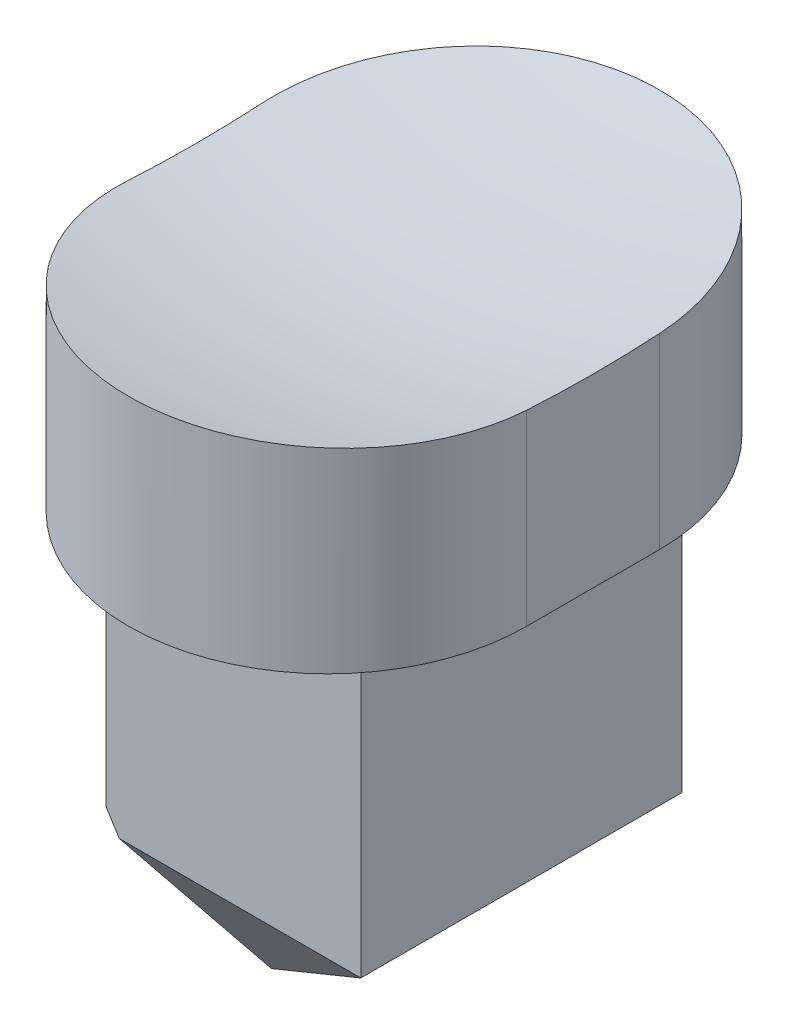
ISO-10303-21;
HEADER;
FILE_DESCRIPTION(('STEP AP214'),'2;1');
FILE_NAME('part.step','',(''),(''),'','','');
FILE_SCHEMA(('AUTOMOTIVE_DESIGN { 1 0 10303 214 1 1 1 1 }'));
ENDSEC;
DATA;
#1=APPLICATION_CONTEXT('core data for automotive mechanical design processes');
#2=APPLICATION_PROTOCOL_DEFINITION('international standard','automotive_design',2000,#1);
#3=PRODUCT_CONTEXT('',#1,'mechanical');
#4=PRODUCT('Part','Part','',(#3));
#5=PRODUCT_RELATED_PRODUCT_CATEGORY('part','',(#4));
#6=PRODUCT_DEFINITION_FORMATION('','',#4);
#7=PRODUCT_DEFINITION_CONTEXT('part definition',#1,'design');
#8=PRODUCT_DEFINITION('design','',#6,#7);
#9=PRODUCT_DEFINITION_SHAPE('','',#8);
#10=(LENGTH_UNIT() NAMED_UNIT(*) SI_UNIT(.MILLI.,.METRE.));
#11=(NAMED_UNIT(*) PLANE_ANGLE_UNIT() SI_UNIT($,.RADIAN.));
#12=(NAMED_UNIT(*) SI_UNIT($,.STERADIAN.) SOLID_ANGLE_UNIT());
#13=UNCERTAINTY_MEASURE_WITH_UNIT(LENGTH_MEASURE(1.E-05),#10,'distance_accuracy_value','');
#14=(GEOMETRIC_REPRESENTATION_CONTEXT(3) GLOBAL_UNCERTAINTY_ASSIGNED_CONTEXT((#13)) GLOBAL_UNIT_ASSIGNED_CONTEXT((#10,
#11,#12)) REPRESENTATION_CONTEXT('',''));
#15=CARTESIAN_POINT('',(0.,0.,0.));
#16=DIRECTION('',(0.,0.,1.));
#17=DIRECTION('',(1.,0.,0.));
#18=AXIS2_PLACEMENT_3D('',#15,#16,#17);
#19=CARTESIAN_POINT('',(0.,22.1,-5.));
#20=DIRECTION('',(0.,1.,0.));
#21=DIRECTION('',(0.,0.,1.));
#22=AXIS2_PLACEMENT_3D('',#19,#20,#21);
#23=PLANE('',#22);
#24=DIRECTION('',(1.,0.,0.));
#25=VECTOR('',#24,1.);
#26=CARTESIAN_POINT('',(0.,22.1,13.15));
#27=LINE('',#26,#25);
#28=CARTESIAN_POINT('',(-10.65,22.1,13.15));
#29=VERTEX_POINT('',#28);
#30=CARTESIAN_POINT('',(10.65,22.1,13.15));
#31=VERTEX_POINT('',#30);
#32=EDGE_CURVE('E301',#29,#31,#27,.T.);
#33=ORIENTED_EDGE('',*,*,#32,.T.);
#34=DIRECTION('',(0.,0.,-1.));
#35=VECTOR('',#34,1.);
#36=CARTESIAN_POINT('',(10.65,22.1,-5.));
#37=LINE('',#36,#35);
#38=CARTESIAN_POINT('',(10.65,22.1,-13.15));
#39=VERTEX_POINT('',#38);
#40=EDGE_CURVE('E330',#31,#39,#37,.T.);
#41=ORIENTED_EDGE('',*,*,#40,.T.);
#42=DIRECTION('',(-1.,0.,0.));
#43=VECTOR('',#42,1.);
#44=CARTESIAN_POINT('',(0.,22.1,-13.15));
#45=LINE('',#44,#43);
#46=CARTESIAN_POINT('',(-10.65,22.1,-13.15));
#47=VERTEX_POINT('',#46);
#48=EDGE_CURVE('E328',#39,#47,#45,.T.);
#49=ORIENTED_EDGE('',*,*,#48,.T.);
#50=DIRECTION('',(0.,0.,1.));
#51=VECTOR('',#50,1.);
#52=CARTESIAN_POINT('',(-10.65,22.1,-5.));
#53=LINE('',#52,#51);
#54=EDGE_CURVE('E326',#47,#29,#53,.T.);
#55=ORIENTED_EDGE('',*,*,#54,.T.);
#56=EDGE_LOOP('',(#33,#41,#49,#55));
#57=FACE_BOUND('',#56,.T.);
#58=CARTESIAN_POINT('',(0.,22.1,-5.));
#59=DIRECTION('',(0.,1.,0.));
#60=DIRECTION('',(0.,0.,1.));
#61=AXIS2_PLACEMENT_3D('',#58,#59,#60);
#62=CIRCLE('',#61,15.);
#63=CARTESIAN_POINT('',(15.,22.1,-4.99999999999999));
#64=VERTEX_POINT('',#63);
#65=CARTESIAN_POINT('',(-15.,22.1,-4.99999999999999));
#66=VERTEX_POINT('',#65);
#67=EDGE_CURVE('E220',#64,#66,#62,.T.);
#68=ORIENTED_EDGE('',*,*,#67,.F.);
#69=DIRECTION('',(0.,0.,-1.));
#70=VECTOR('',#69,1.);
#71=CARTESIAN_POINT('',(15.,22.1,-4.99999999999999));
#72=LINE('',#71,#70);
#73=CARTESIAN_POINT('',(15.,22.1,4.99999999999999));
#74=VERTEX_POINT('',#73);
#75=EDGE_CURVE('E186',#74,#64,#72,.T.);
#76=ORIENTED_EDGE('',*,*,#75,.F.);
#77=CARTESIAN_POINT('',(0.,22.1,5.));
#78=DIRECTION('',(0.,1.,0.));
#79=DIRECTION('',(0.,0.,1.));
#80=AXIS2_PLACEMENT_3D('',#77,#78,#79);
#81=CIRCLE('',#80,15.);
#82=CARTESIAN_POINT('',(-15.,22.1,4.99999999999998));
#83=VERTEX_POINT('',#82);
#84=EDGE_CURVE('E213',#83,#74,#81,.T.);
#85=ORIENTED_EDGE('',*,*,#84,.F.);
#86=DIRECTION('',(0.,0.,1.));
#87=VECTOR('',#86,1.);
#88=CARTESIAN_POINT('',(-15.,22.1,-4.99999999999999));
#89=LINE('',#88,#87);
#90=EDGE_CURVE('E209',#66,#83,#89,.T.);
#91=ORIENTED_EDGE('',*,*,#90,.F.);
#92=EDGE_LOOP('',(#68,#76,#85,#91));
#93=FACE_BOUND('',#92,.T.);
#94=ADVANCED_FACE('F96',(#57,#93),#23,.F.);
#95=CARTESIAN_POINT('',(0.,37.1,-5.));
#96=DIRECTION('',(0.,-1.,0.));
#97=DIRECTION('',(0.,0.,-1.));
#98=AXIS2_PLACEMENT_3D('',#95,#96,#97);
#99=CYLINDRICAL_SURFACE('',#98,15.);
#100=DIRECTION('',(0.,-1.,0.));
#101=VECTOR('',#100,1.);
#102=CARTESIAN_POINT('',(-15.,37.1,-4.99999999999999));
#103=LINE('',#102,#101);
#104=CARTESIAN_POINT('',(-15.,36.2001789978045,-4.99999999999999));
#105=VERTEX_POINT('',#104);
#106=EDGE_CURVE('E207',#105,#66,#103,.T.);
#107=ORIENTED_EDGE('',*,*,#106,.F.);
#108=CARTESIAN_POINT('',(-14.9999999986667,36.2001670646057,-4.99979999999999));
#109=CARTESIAN_POINT('',(-15.0000505971134,36.225372023753,-5.4222362160583));
#110=CARTESIAN_POINT('',(-14.9821679105655,36.2505881800374,-5.84466570095554));
#111=CARTESIAN_POINT('',(-14.9108609043045,36.300862785471,-6.68650562986717));
#112=CARTESIAN_POINT('',(-14.8574381659499,36.3259212415869,-7.10591620736893));
#113=CARTESIAN_POINT('',(-14.7154223005256,36.375686374263,-7.93847907650016));
#114=CARTESIAN_POINT('',(-14.6268521512979,36.4003932697485,-8.35163527413465));
#115=CARTESIAN_POINT('',(-14.4151793673019,36.4492950471374,-9.1690299406811));
#116=CARTESIAN_POINT('',(-14.292077173893,36.4734899355806,-9.57326852349926));
#117=CARTESIAN_POINT('',(-14.0121336587021,36.5212061012485,-10.3701538849595));
#118=CARTESIAN_POINT('',(-13.8552758604046,36.5447270431359,-10.7627948958668));
#119=CARTESIAN_POINT('',(-13.5089637359969,36.590913401162,-11.5334806097786));
#120=CARTESIAN_POINT('',(-13.3195094386151,36.6135788180546,-11.911525325647));
#121=CARTESIAN_POINT('',(-12.9093836228457,36.6578855797966,-12.650245472503));
#122=CARTESIAN_POINT('',(-12.6887185384304,36.679527134487,-13.0109244628722));
#123=CARTESIAN_POINT('',(-12.217702380577,36.7216339066189,-13.7124184148315));
#124=CARTESIAN_POINT('',(-11.9673514637172,36.7420991302643,-14.05323348118));
#125=CARTESIAN_POINT('',(-11.4389338729753,36.7816892599247,-14.712314921096));
#126=CARTESIAN_POINT('',(-11.1608881896398,36.8008151625988,-15.0305980638216));
#127=CARTESIAN_POINT('',(-10.5788921592146,36.8376038273064,-15.6426201274413));
#128=CARTESIAN_POINT('',(-10.2749417745466,36.8552665872172,-15.9363590127294));
#129=CARTESIAN_POINT('',(-9.64324599968441,36.88900186209,-16.4972273210325));
#130=CARTESIAN_POINT('',(-9.31549710200202,36.9050741418145,-16.764352807876));
#131=CARTESIAN_POINT('',(-8.6385739128506,36.9355071163803,-17.2700253616051));
#132=CARTESIAN_POINT('',(-8.28939965765111,36.9498678141188,-17.508572476867));
#133=CARTESIAN_POINT('',(-7.57273722717455,36.9767480824665,-17.9549821451278));
#134=CARTESIAN_POINT('',(-7.20528201927106,36.9892708171931,-18.1628974342883));
#135=CARTESIAN_POINT('',(-6.45410999467888,37.01241245355,-18.5470447185739));
#136=CARTESIAN_POINT('',(-6.07039319391636,37.0230313570449,-18.7232767447279));
#137=CARTESIAN_POINT('',(-5.28945725430007,37.0422859979748,-19.0427780307539));
#138=CARTESIAN_POINT('',(-4.89223908545358,37.050921877536,-19.1860496529486));
#139=CARTESIAN_POINT('',(-4.08710512381802,37.0661473428441,-19.4386141454512));
#140=CARTESIAN_POINT('',(-3.67918934188229,37.0727369306668,-19.5479070502309));
#141=CARTESIAN_POINT('',(-2.85622623604338,37.0838119920331,-19.7315796883256));
#142=CARTESIAN_POINT('',(-2.44119129872767,37.0883007984586,-19.8060147236421));
#143=CARTESIAN_POINT('',(-1.60631240182303,37.0951564780238,-19.9196932375491));
#144=CARTESIAN_POINT('',(-1.18646844743868,37.0975233534596,-19.9589367542221));
#145=CARTESIAN_POINT('',(-0.344953273708517,37.1001176139483,-20.001950207149));
#146=CARTESIAN_POINT('',(0.0767179779047312,37.100344961065,-20.0057195144048));
#147=CARTESIAN_POINT('',(0.918877310137343,37.0986583762127,-19.9777557681976));
#148=CARTESIAN_POINT('',(1.33936539105418,37.096744444782,-19.9460227236614));
#149=CARTESIAN_POINT('',(2.17582436034105,37.0907919455528,-19.8473228610139));
#150=CARTESIAN_POINT('',(2.5917986360909,37.0867551023708,-19.7803846429692));
#151=CARTESIAN_POINT('',(3.41662021867459,37.076587741602,-19.6117725229433));
#152=CARTESIAN_POINT('',(3.82546753065938,37.0704572255285,-19.5100986460679));
#153=CARTESIAN_POINT('',(4.63313065257542,37.0561479300767,-19.272745493707));
#154=CARTESIAN_POINT('',(5.03194649796884,37.0479691579404,-19.1370663384519));
#155=CARTESIAN_POINT('',(5.81671915611364,37.0296237807565,-18.8326754109088));
#156=CARTESIAN_POINT('',(6.20267596252054,37.0194571747281,-18.6639636223232));
#157=CARTESIAN_POINT('',(6.95914649743477,36.997206664887,-18.2946422311087));
#158=CARTESIAN_POINT('',(7.32965401650439,36.9851219993631,-18.0940199559307));
#159=CARTESIAN_POINT('',(8.05243956871306,36.9591272223988,-17.662361718047));
#160=CARTESIAN_POINT('',(8.40471759436956,36.945217110209,-17.4313257428578));
#161=CARTESIAN_POINT('',(9.08853860660945,36.9156741731514,-16.9405019991736));
#162=CARTESIAN_POINT('',(9.42008251368116,36.9000414248449,-16.6807155084741));
#163=CARTESIAN_POINT('',(10.0601125324881,36.8671670603081,-16.1342357508033));
#164=CARTESIAN_POINT('',(10.3685986625505,36.8499254453565,-15.847542505219));
#165=CARTESIAN_POINT('',(10.9607072661255,36.8139366891092,-15.2489194936914));
#166=CARTESIAN_POINT('',(11.2442984914738,36.7951877107306,-14.9369589299258));
#167=CARTESIAN_POINT('',(11.7841914602273,36.756339134032,-14.2903302847405));
#168=CARTESIAN_POINT('',(12.0404929784728,36.7362395245706,-13.9556620160034));
#169=CARTESIAN_POINT('',(12.5240821456442,36.6948285623558,-13.2658840525618));
#170=CARTESIAN_POINT('',(12.7513600065915,36.6735168042996,-12.9107675201289));
#171=CARTESIAN_POINT('',(13.1751970272208,36.6298423552078,-12.1827291049954));
#172=CARTESIAN_POINT('',(13.3717570847364,36.6074796949133,-11.8098077431183));
#173=CARTESIAN_POINT('',(13.7332179907482,36.5618094183407,-11.0478875081639));
#174=CARTESIAN_POINT('',(13.8980422253582,36.5384996758395,-10.6588524164859));
#175=CARTESIAN_POINT('',(14.1942860222416,36.4911532445589,-9.86830739179908));
#176=CARTESIAN_POINT('',(14.3257057335659,36.4671165590235,-9.46679751446172));
#177=CARTESIAN_POINT('',(14.5540704193931,36.4185205439717,-8.65468816199068));
#178=CARTESIAN_POINT('',(14.6510591891351,36.3939619208176,-8.24410094467479));
#179=CARTESIAN_POINT('',(14.8100796881022,36.3444766353984,-7.41640222588438));
#180=CARTESIAN_POINT('',(14.8721285052236,36.3195501591691,-6.99929401636119));
#181=CARTESIAN_POINT('',(14.9443461299928,36.2788364920903,-6.31770273442135));
#182=CARTESIAN_POINT('',(14.965232792922,36.2631073330853,-6.05430539317481));
#183=CARTESIAN_POINT('',(14.9930514530183,36.2316402058825,-5.52721450506767));
#184=CARTESIAN_POINT('',(15.0000065075313,36.2159022954325,-5.26352217152712));
#185=CARTESIAN_POINT('',(14.9999999986667,36.2001670646057,-4.99979999999999));
#186=B_SPLINE_CURVE_WITH_KNOTS('',3,(#108,#109,#110,#111,#112,#113,#114,#115,#116,#117,#118,
#119,#120,#121,#122,#123,#124,#125,#126,#127,#128,#129,#130,#131,#132,#133,#134,#135,#136,#137,
#138,#139,#140,#141,#142,#143,#144,#145,#146,#147,#148,#149,#150,#151,#152,#153,#154,#155,#156,
#157,#158,#159,#160,#161,#162,#163,#164,#165,#166,#167,#168,#169,#170,#171,#172,#173,#174,#175,
#176,#177,#178,#179,#180,#181,#182,#183,#184,#185),.UNSPECIFIED.,.F.,.F.,(4,2,2,2,2,2,2,2,2,2,2,
2,2,2,2,2,2,2,2,2,2,2,2,2,2,2,2,2,2,2,2,2,2,2,2,2,2,2,4),(0.,1.26917572026778,2.53829497219462,
3.80658589265856,5.07486060363743,6.34375578456622,7.61264984717396,8.88128271282821,
10.149908887357,11.4175807514039,12.6852544544128,13.9531153712605,15.2209741418907,
16.486623982296,17.7522725831864,19.0178304448206,20.2833870225228,21.5469289355155,
22.8104694811646,24.0740324307842,25.3375950626915,26.6001327804068,27.862669585599,
29.125201926978,30.387734891265,31.6507705004315,32.9138066280253,34.1767866434419,
35.439765654983,36.7043079466293,37.9688606708409,39.2338387346364,40.498779818175,
41.7667373436089,43.0346892113164,44.3010224500856,45.5667358309269,46.3604734084631,
47.152896230875),.UNSPECIFIED.);
#187=CARTESIAN_POINT('',(15.,36.2001789978045,-4.99999999999999));
#188=VERTEX_POINT('',#187);
#189=EDGE_CURVE('E202',#105,#188,#186,.T.);
#190=ORIENTED_EDGE('',*,*,#189,.T.);
#191=DIRECTION('',(0.,-1.,0.));
#192=VECTOR('',#191,1.);
#193=CARTESIAN_POINT('',(15.,37.1,-4.99999999999999));
#194=LINE('',#193,#192);
#195=EDGE_CURVE('E218',#188,#64,#194,.T.);
#196=ORIENTED_EDGE('',*,*,#195,.T.);
#197=ORIENTED_EDGE('',*,*,#67,.T.);
#198=EDGE_LOOP('',(#107,#190,#196,#197));
#199=FACE_BOUND('',#198,.T.);
#200=ADVANCED_FACE('F244',(#199),#99,.T.);
#201=CARTESIAN_POINT('',(-15.,37.1,-4.99999999999999));
#202=DIRECTION('',(1.,0.,0.));
#203=DIRECTION('',(0.,0.,-1.));
#204=AXIS2_PLACEMENT_3D('',#201,#202,#203);
#205=PLANE('',#204);
#206=DIRECTION('',(0.,-1.,0.));
#207=VECTOR('',#206,1.);
#208=CARTESIAN_POINT('',(-15.,37.1,4.99999999999998));
#209=LINE('',#208,#207);
#210=CARTESIAN_POINT('',(-15.,36.2001789978045,4.99999999999998));
#211=VERTEX_POINT('',#210);
#212=EDGE_CURVE('E211',#211,#83,#209,.T.);
#213=ORIENTED_EDGE('',*,*,#212,.F.);
#214=CARTESIAN_POINT('',(-15.,120.,0.));
#215=DIRECTION('',(1.,0.,0.));
#216=DIRECTION('',(0.,0.,-1.));
#217=AXIS2_PLACEMENT_3D('',#214,#215,#216);
#218=CIRCLE('',#217,83.9488534763876);
#219=EDGE_CURVE('E210',#211,#105,#218,.T.);
#220=ORIENTED_EDGE('',*,*,#219,.T.);
#221=ORIENTED_EDGE('',*,*,#106,.T.);
#222=ORIENTED_EDGE('',*,*,#90,.T.);
#223=EDGE_LOOP('',(#213,#220,#221,#222));
#224=FACE_BOUND('',#223,.T.);
#225=ADVANCED_FACE('F296',(#224),#205,.F.);
#226=CARTESIAN_POINT('',(0.,37.1,5.));
#227=DIRECTION('',(0.,-1.,0.));
#228=DIRECTION('',(0.,0.,-1.));
#229=AXIS2_PLACEMENT_3D('',#226,#227,#228);
#230=CYLINDRICAL_SURFACE('',#229,15.);
#231=DIRECTION('',(0.,-1.,0.));
#232=VECTOR('',#231,1.);
#233=CARTESIAN_POINT('',(15.,37.1,4.99999999999999));
#234=LINE('',#233,#232);
#235=CARTESIAN_POINT('',(15.,36.2001789978045,4.99999999999999));
#236=VERTEX_POINT('',#235);
#237=EDGE_CURVE('E215',#236,#74,#234,.T.);
#238=ORIENTED_EDGE('',*,*,#237,.F.);
#239=CARTESIAN_POINT('',(14.9999999986667,36.2001670646057,4.99979999999998));
#240=CARTESIAN_POINT('',(15.0000505971134,36.225372023753,5.4222362160583));
#241=CARTESIAN_POINT('',(14.9821679105655,36.2505881800374,5.84466570095554));
#242=CARTESIAN_POINT('',(14.9108609043045,36.300862785471,6.68650562986717));
#243=CARTESIAN_POINT('',(14.8574381659499,36.3259212415869,7.10591620736892));
#244=CARTESIAN_POINT('',(14.7154223005256,36.375686374263,7.93847907650015));
#245=CARTESIAN_POINT('',(14.6268521512979,36.4003932697485,8.35163527413464));
#246=CARTESIAN_POINT('',(14.4151793673019,36.4492950471374,9.16902994068109));
#247=CARTESIAN_POINT('',(14.292077173893,36.4734899355806,9.57326852349926));
#248=CARTESIAN_POINT('',(14.0121336587021,36.5212061012485,10.3701538849595));
#249=CARTESIAN_POINT('',(13.8552758604046,36.5447270431359,10.7627948958668));
#250=CARTESIAN_POINT('',(13.5089637359969,36.590913401162,11.5334806097786));
#251=CARTESIAN_POINT('',(13.3195094386151,36.6135788180546,11.911525325647));
#252=CARTESIAN_POINT('',(12.9093836228457,36.6578855797966,12.650245472503));
#253=CARTESIAN_POINT('',(12.6887185384304,36.679527134487,13.0109244628722));
#254=CARTESIAN_POINT('',(12.217702380577,36.7216339066189,13.7124184148314));
#255=CARTESIAN_POINT('',(11.9673514637172,36.7420991302643,14.05323348118));
#256=CARTESIAN_POINT('',(11.4389338729753,36.7816892599247,14.712314921096));
#257=CARTESIAN_POINT('',(11.1608881896398,36.8008151625989,15.0305980638216));
#258=CARTESIAN_POINT('',(10.5788921592146,36.8376038273064,15.6426201274413));
#259=CARTESIAN_POINT('',(10.2749417745466,36.8552665872172,15.9363590127294));
#260=CARTESIAN_POINT('',(9.64324599968442,36.88900186209,16.4972273210324));
#261=CARTESIAN_POINT('',(9.31549710200203,36.9050741418145,16.764352807876));
#262=CARTESIAN_POINT('',(8.6385739128506,36.9355071163802,17.2700253616051));
#263=CARTESIAN_POINT('',(8.28939965765112,36.9498678141188,17.508572476867));
#264=CARTESIAN_POINT('',(7.57273722717456,36.9767480824665,17.9549821451278));
#265=CARTESIAN_POINT('',(7.20528201927107,36.9892708171931,18.1628974342883));
#266=CARTESIAN_POINT('',(6.45410999467889,37.01241245355,18.5470447185739));
#267=CARTESIAN_POINT('',(6.07039319391637,37.0230313570449,18.7232767447279));
#268=CARTESIAN_POINT('',(5.28945725430008,37.0422859979747,19.0427780307539));
#269=CARTESIAN_POINT('',(4.89223908545359,37.050921877536,19.1860496529486));
#270=CARTESIAN_POINT('',(4.08710512381802,37.0661473428441,19.4386141454512));
#271=CARTESIAN_POINT('',(3.6791893418823,37.0727369306668,19.5479070502309));
#272=CARTESIAN_POINT('',(2.85622623604339,37.0838119920331,19.7315796883256));
#273=CARTESIAN_POINT('',(2.44119129872767,37.0883007984586,19.8060147236421));
#274=CARTESIAN_POINT('',(1.60631240182304,37.0951564780238,19.9196932375491));
#275=CARTESIAN_POINT('',(1.18646844743869,37.0975233534596,19.9589367542221));
#276=CARTESIAN_POINT('',(0.344953273708525,37.1001176139483,20.001950207149));
#277=CARTESIAN_POINT('',(-0.0767179779047238,37.100344961065,20.0057195144048));
#278=CARTESIAN_POINT('',(-0.918877310137338,37.0986583762127,19.9777557681976));
#279=CARTESIAN_POINT('',(-1.33936539105417,37.096744444782,19.9460227236614));
#280=CARTESIAN_POINT('',(-2.17582436034105,37.0907919455528,19.8473228610139));
#281=CARTESIAN_POINT('',(-2.59179863609089,37.0867551023708,19.7803846429692));
#282=CARTESIAN_POINT('',(-3.41662021867459,37.076587741602,19.6117725229433));
#283=CARTESIAN_POINT('',(-3.82546753065938,37.0704572255285,19.5100986460679));
#284=CARTESIAN_POINT('',(-4.63313065257541,37.0561479300767,19.272745493707));
#285=CARTESIAN_POINT('',(-5.03194649796883,37.0479691579404,19.1370663384519));
#286=CARTESIAN_POINT('',(-5.81671915611363,37.0296237807565,18.8326754109088));
#287=CARTESIAN_POINT('',(-6.20267596252054,37.0194571747281,18.6639636223232));
#288=CARTESIAN_POINT('',(-6.95914649743477,36.997206664887,18.2946422311087));
#289=CARTESIAN_POINT('',(-7.32965401650439,36.9851219993631,18.0940199559307));
#290=CARTESIAN_POINT('',(-8.05243956871306,36.9591272223988,17.662361718047));
#291=CARTESIAN_POINT('',(-8.40471759436956,36.945217110209,17.4313257428578));
#292=CARTESIAN_POINT('',(-9.08853860660945,36.9156741731514,16.9405019991737));
#293=CARTESIAN_POINT('',(-9.42008251368116,36.9000414248449,16.6807155084741));
#294=CARTESIAN_POINT('',(-10.0601125324881,36.8671670603081,16.1342357508033));
#295=CARTESIAN_POINT('',(-10.3685986625505,36.8499254453565,15.847542505219));
#296=CARTESIAN_POINT('',(-10.9607072661255,36.8139366891092,15.2489194936914));
#297=CARTESIAN_POINT('',(-11.2442984914738,36.7951877107306,14.9369589299258));
#298=CARTESIAN_POINT('',(-11.7841914602273,36.756339134032,14.2903302847405));
#299=CARTESIAN_POINT('',(-12.0404929784728,36.7362395245706,13.9556620160034));
#300=CARTESIAN_POINT('',(-12.5240821456442,36.6948285623558,13.2658840525619));
#301=CARTESIAN_POINT('',(-12.7513600065915,36.6735168042995,12.9107675201289));
#302=CARTESIAN_POINT('',(-13.1751970272208,36.6298423552078,12.1827291049954));
#303=CARTESIAN_POINT('',(-13.3717570847364,36.6074796949134,11.8098077431183));
#304=CARTESIAN_POINT('',(-13.7332179907482,36.5618094183407,11.0478875081639));
#305=CARTESIAN_POINT('',(-13.8980422253582,36.5384996758396,10.6588524164859));
#306=CARTESIAN_POINT('',(-14.1942860222416,36.4911532445589,9.86830739179909));
#307=CARTESIAN_POINT('',(-14.3257057335659,36.4671165590235,9.46679751446173));
#308=CARTESIAN_POINT('',(-14.5540704193931,36.4185205439717,8.6546881619907));
#309=CARTESIAN_POINT('',(-14.6510591891351,36.3939619208176,8.2441009446748));
#310=CARTESIAN_POINT('',(-14.8100796881022,36.3444766353984,7.41640222588439));
#311=CARTESIAN_POINT('',(-14.8721285052236,36.3195501591691,6.9992940163612));
#312=CARTESIAN_POINT('',(-14.9443461299928,36.2788364920903,6.31770273442136));
#313=CARTESIAN_POINT('',(-14.965232792922,36.2631073330853,6.05430539317482));
#314=CARTESIAN_POINT('',(-14.9930514530183,36.2316402058825,5.52721450506767));
#315=CARTESIAN_POINT('',(-15.0000065075313,36.2159022954325,5.26352217152712));
#316=CARTESIAN_POINT('',(-14.9999999986667,36.2001670646057,4.99979999999998));
#317=B_SPLINE_CURVE_WITH_KNOTS('',3,(#239,#240,#241,#242,#243,#244,#245,#246,#247,#248,#249,
#250,#251,#252,#253,#254,#255,#256,#257,#258,#259,#260,#261,#262,#263,#264,#265,#266,#267,#268,
#269,#270,#271,#272,#273,#274,#275,#276,#277,#278,#279,#280,#281,#282,#283,#284,#285,#286,#287,
#288,#289,#290,#291,#292,#293,#294,#295,#296,#297,#298,#299,#300,#301,#302,#303,#304,#305,#306,
#307,#308,#309,#310,#311,#312,#313,#314,#315,#316),.UNSPECIFIED.,.F.,.F.,(4,2,2,2,2,2,2,2,2,2,2,
2,2,2,2,2,2,2,2,2,2,2,2,2,2,2,2,2,2,2,2,2,2,2,2,2,2,2,4),(0.,1.26917572026778,2.53829497219462,
3.80658589265856,5.07486060363742,6.34375578456621,7.61264984717395,8.8812827128282,
10.149908887357,11.4175807514039,12.6852544544128,13.9531153712605,15.2209741418907,
16.486623982296,17.7522725831863,19.0178304448206,20.2833870225228,21.5469289355155,
22.8104694811646,24.0740324307842,25.3375950626915,26.6001327804068,27.862669585599,
29.125201926978,30.387734891265,31.6507705004315,32.9138066280253,34.1767866434419,
35.439765654983,36.7043079466294,37.9688606708409,39.2338387346364,40.498779818175,
41.7667373436089,43.0346892113164,44.3010224500856,45.5667358309269,46.3604734084631,
47.152896230875),.UNSPECIFIED.);
#318=EDGE_CURVE('E214',#236,#211,#317,.T.);
#319=ORIENTED_EDGE('',*,*,#318,.T.);
#320=ORIENTED_EDGE('',*,*,#212,.T.);
#321=ORIENTED_EDGE('',*,*,#84,.T.);
#322=EDGE_LOOP('',(#238,#319,#320,#321));
#323=FACE_BOUND('',#322,.T.);
#324=ADVANCED_FACE('F315',(#323),#230,.T.);
#325=CARTESIAN_POINT('',(15.,37.1,-4.99999999999999));
#326=DIRECTION('',(-1.,0.,0.));
#327=DIRECTION('',(0.,0.,1.));
#328=AXIS2_PLACEMENT_3D('',#325,#326,#327);
#329=PLANE('',#328);
#330=ORIENTED_EDGE('',*,*,#195,.F.);
#331=CARTESIAN_POINT('',(15.,120.,0.));
#332=DIRECTION('',(-1.,0.,0.));
#333=DIRECTION('',(0.,0.,1.));
#334=AXIS2_PLACEMENT_3D('',#331,#332,#333);
#335=CIRCLE('',#334,83.9488534763876);
#336=EDGE_CURVE('E217',#188,#236,#335,.T.);
#337=ORIENTED_EDGE('',*,*,#336,.T.);
#338=ORIENTED_EDGE('',*,*,#237,.T.);
#339=ORIENTED_EDGE('',*,*,#75,.T.);
#340=EDGE_LOOP('',(#330,#337,#338,#339));
#341=FACE_BOUND('',#340,.T.);
#342=ADVANCED_FACE('F252',(#341),#329,.F.);
#343=CARTESIAN_POINT('',(0.,120.,0.));
#344=DIRECTION('',(0.,0.,1.));
#345=DIRECTION('',(0.,1.,0.));
#346=AXIS2_PLACEMENT_3D('',#343,#344,#345);
#347=SPHERICAL_SURFACE('',#346,85.278426345706);
#348=ORIENTED_EDGE('',*,*,#318,.F.);
#349=ORIENTED_EDGE('',*,*,#336,.F.);
#350=ORIENTED_EDGE('',*,*,#189,.F.);
#351=ORIENTED_EDGE('',*,*,#219,.F.);
#352=EDGE_LOOP('',(#348,#349,#350,#351));
#353=FACE_BOUND('',#352,.T.);
#354=ADVANCED_FACE('F247',(#353),#347,.F.);
#355=CARTESIAN_POINT('',(9.9,32.1,0.));
#356=DIRECTION('',(1.,0.,0.));
#357=DIRECTION('',(0.,0.,-1.));
#358=AXIS2_PLACEMENT_3D('',#355,#356,#357);
#359=PLANE('',#358);
#360=DIRECTION('',(0.,-1.,0.));
#361=VECTOR('',#360,1.);
#362=CARTESIAN_POINT('',(9.9,32.1,-12.4));
#363=LINE('',#362,#361);
#364=CARTESIAN_POINT('',(9.9,32.4,-12.4));
#365=VERTEX_POINT('',#364);
#366=CARTESIAN_POINT('',(9.9,22.85,-12.4));
#367=VERTEX_POINT('',#366);
#368=EDGE_CURVE('E174',#365,#367,#363,.T.);
#369=ORIENTED_EDGE('',*,*,#368,.T.);
#370=DIRECTION('',(0.,0.,1.));
#371=VECTOR('',#370,1.);
#372=CARTESIAN_POINT('',(9.9,22.85,0.));
#373=LINE('',#372,#371);
#374=CARTESIAN_POINT('',(9.9,22.85,12.4));
#375=VERTEX_POINT('',#374);
#376=EDGE_CURVE('E195',#367,#375,#373,.T.);
#377=ORIENTED_EDGE('',*,*,#376,.T.);
#378=DIRECTION('',(0.,-1.,0.));
#379=VECTOR('',#378,1.);
#380=CARTESIAN_POINT('',(9.9,32.1,12.4));
#381=LINE('',#380,#379);
#382=CARTESIAN_POINT('',(9.9,32.4,12.4));
#383=VERTEX_POINT('',#382);
#384=EDGE_CURVE('E199',#383,#375,#381,.T.);
#385=ORIENTED_EDGE('',*,*,#384,.F.);
#386=DIRECTION('',(0.,0.,1.));
#387=VECTOR('',#386,1.);
#388=CARTESIAN_POINT('',(9.9,32.4,12.4));
#389=LINE('',#388,#387);
#390=EDGE_CURVE('E192',#365,#383,#389,.T.);
#391=ORIENTED_EDGE('',*,*,#390,.F.);
#392=EDGE_LOOP('',(#369,#377,#385,#391));
#393=FACE_BOUND('',#392,.T.);
#394=ADVANCED_FACE('F198',(#393),#359,.F.);
#395=CARTESIAN_POINT('',(0.,32.1,-12.4));
#396=DIRECTION('',(0.,0.,-1.));
#397=DIRECTION('',(-1.,0.,0.));
#398=AXIS2_PLACEMENT_3D('',#395,#396,#397);
#399=PLANE('',#398);
#400=DIRECTION('',(0.,-1.,0.));
#401=VECTOR('',#400,1.);
#402=CARTESIAN_POINT('',(-9.9,32.1,-12.4));
#403=LINE('',#402,#401);
#404=CARTESIAN_POINT('',(-9.9,32.4,-12.4));
#405=VERTEX_POINT('',#404);
#406=CARTESIAN_POINT('',(-9.9,22.85,-12.4));
#407=VERTEX_POINT('',#406);
#408=EDGE_CURVE('E185',#405,#407,#403,.T.);
#409=ORIENTED_EDGE('',*,*,#408,.T.);
#410=DIRECTION('',(1.,0.,0.));
#411=VECTOR('',#410,1.);
#412=CARTESIAN_POINT('',(0.,22.85,-12.4));
#413=LINE('',#412,#411);
#414=EDGE_CURVE('E180',#407,#367,#413,.T.);
#415=ORIENTED_EDGE('',*,*,#414,.T.);
#416=ORIENTED_EDGE('',*,*,#368,.F.);
#417=DIRECTION('',(-1.,0.,0.));
#418=VECTOR('',#417,1.);
#419=CARTESIAN_POINT('',(34.4018144497535,32.4,-12.4));
#420=LINE('',#419,#418);
#421=EDGE_CURVE('E177',#365,#405,#420,.T.);
#422=ORIENTED_EDGE('',*,*,#421,.T.);
#423=EDGE_LOOP('',(#409,#415,#416,#422));
#424=FACE_BOUND('',#423,.T.);
#425=ADVANCED_FACE('F176',(#424),#399,.F.);
#426=CARTESIAN_POINT('',(-9.9,32.1,0.));
#427=DIRECTION('',(-1.,0.,0.));
#428=DIRECTION('',(0.,0.,1.));
#429=AXIS2_PLACEMENT_3D('',#426,#427,#428);
#430=PLANE('',#429);
#431=DIRECTION('',(0.,-1.,0.));
#432=VECTOR('',#431,1.);
#433=CARTESIAN_POINT('',(-9.9,32.1,12.4));
#434=LINE('',#433,#432);
#435=CARTESIAN_POINT('',(-9.9,32.4,12.4));
#436=VERTEX_POINT('',#435);
#437=CARTESIAN_POINT('',(-9.9,22.85,12.4));
#438=VERTEX_POINT('',#437);
#439=EDGE_CURVE('E320',#436,#438,#434,.T.);
#440=ORIENTED_EDGE('',*,*,#439,.T.);
#441=DIRECTION('',(0.,0.,-1.));
#442=VECTOR('',#441,1.);
#443=CARTESIAN_POINT('',(-9.9,22.85,0.));
#444=LINE('',#443,#442);
#445=EDGE_CURVE('E106',#438,#407,#444,.T.);
#446=ORIENTED_EDGE('',*,*,#445,.T.);
#447=ORIENTED_EDGE('',*,*,#408,.F.);
#448=DIRECTION('',(0.,0.,-1.));
#449=VECTOR('',#448,1.);
#450=CARTESIAN_POINT('',(-9.9,32.4,12.4));
#451=LINE('',#450,#449);
#452=EDGE_CURVE('E194',#436,#405,#451,.T.);
#453=ORIENTED_EDGE('',*,*,#452,.F.);
#454=EDGE_LOOP('',(#440,#446,#447,#453));
#455=FACE_BOUND('',#454,.T.);
#456=ADVANCED_FACE('F261',(#455),#430,.F.);
#457=CARTESIAN_POINT('',(0.,32.1,12.4));
#458=DIRECTION('',(0.,0.,1.));
#459=DIRECTION('',(1.,0.,0.));
#460=AXIS2_PLACEMENT_3D('',#457,#458,#459);
#461=PLANE('',#460);
#462=ORIENTED_EDGE('',*,*,#384,.T.);
#463=DIRECTION('',(-1.,0.,0.));
#464=VECTOR('',#463,1.);
#465=CARTESIAN_POINT('',(0.,22.85,12.4));
#466=LINE('',#465,#464);
#467=EDGE_CURVE('E13',#375,#438,#466,.T.);
#468=ORIENTED_EDGE('',*,*,#467,.T.);
#469=ORIENTED_EDGE('',*,*,#439,.F.);
#470=DIRECTION('',(-1.,0.,0.));
#471=VECTOR('',#470,1.);
#472=CARTESIAN_POINT('',(34.4018144497535,32.4,12.4));
#473=LINE('',#472,#471);
#474=EDGE_CURVE('E196',#383,#436,#473,.T.);
#475=ORIENTED_EDGE('',*,*,#474,.F.);
#476=EDGE_LOOP('',(#462,#468,#469,#475));
#477=FACE_BOUND('',#476,.T.);
#478=ADVANCED_FACE('F258',(#477),#461,.F.);
#479=CARTESIAN_POINT('',(34.4018144497535,32.4,-12.4));
#480=DIRECTION('',(0.,1.,0.));
#481=DIRECTION('',(0.,0.,1.));
#482=AXIS2_PLACEMENT_3D('',#479,#480,#481);
#483=PLANE('',#482);
#484=ORIENTED_EDGE('',*,*,#421,.F.);
#485=ORIENTED_EDGE('',*,*,#390,.T.);
#486=ORIENTED_EDGE('',*,*,#474,.T.);
#487=ORIENTED_EDGE('',*,*,#452,.T.);
#488=EDGE_LOOP('',(#484,#485,#486,#487));
#489=FACE_BOUND('',#488,.T.);
#490=ADVANCED_FACE('F190',(#489),#483,.F.);
#491=CARTESIAN_POINT('',(-9.9,22.85,0.));
#492=DIRECTION('',(-0.707106781186545,0.70710678118655,0.));
#493=DIRECTION('',(0.,0.,-1.));
#494=AXIS2_PLACEMENT_3D('',#491,#492,#493);
#495=PLANE('',#494);
#496=DIRECTION('',(0.577350269189627,0.577350269189622,-0.577350269189629));
#497=VECTOR('',#496,1.);
#498=CARTESIAN_POINT('',(-5.76666666666664,26.9833333333333,8.26666666666662));
#499=LINE('',#498,#497);
#500=EDGE_CURVE('E205',#29,#438,#499,.T.);
#501=ORIENTED_EDGE('',*,*,#500,.F.);
#502=ORIENTED_EDGE('',*,*,#54,.F.);
#503=DIRECTION('',(0.577350269189627,0.577350269189622,0.577350269189628));
#504=VECTOR('',#503,1.);
#505=CARTESIAN_POINT('',(-6.59999999999998,26.15,-9.09999999999998));
#506=LINE('',#505,#504);
#507=EDGE_CURVE('E101',#407,#47,#506,.F.);
#508=ORIENTED_EDGE('',*,*,#507,.F.);
#509=ORIENTED_EDGE('',*,*,#445,.F.);
#510=EDGE_LOOP('',(#501,#502,#508,#509));
#511=FACE_BOUND('',#510,.T.);
#512=ADVANCED_FACE('F99',(#511),#495,.F.);
#513=CARTESIAN_POINT('',(0.,22.85,-12.4));
#514=DIRECTION('',(0.,0.707106781186551,-0.707106781186544));
#515=DIRECTION('',(1.,0.,0.));
#516=AXIS2_PLACEMENT_3D('',#513,#514,#515);
#517=PLANE('',#516);
#518=ORIENTED_EDGE('',*,*,#507,.T.);
#519=ORIENTED_EDGE('',*,*,#48,.F.);
#520=DIRECTION('',(-0.577350269189628,0.577350269189622,0.577350269189628));
#521=VECTOR('',#520,1.);
#522=CARTESIAN_POINT('',(5.76666666666664,26.9833333333333,-8.26666666666664));
#523=LINE('',#522,#521);
#524=EDGE_CURVE('E336',#367,#39,#523,.F.);
#525=ORIENTED_EDGE('',*,*,#524,.F.);
#526=ORIENTED_EDGE('',*,*,#414,.F.);
#527=EDGE_LOOP('',(#518,#519,#525,#526));
#528=FACE_BOUND('',#527,.T.);
#529=ADVANCED_FACE('F281',(#528),#517,.F.);
#530=CARTESIAN_POINT('',(0.,22.85,12.4));
#531=DIRECTION('',(0.,0.707106781186552,0.707106781186543));
#532=DIRECTION('',(-1.,0.,0.));
#533=AXIS2_PLACEMENT_3D('',#530,#531,#532);
#534=PLANE('',#533);
#535=ORIENTED_EDGE('',*,*,#500,.T.);
#536=ORIENTED_EDGE('',*,*,#467,.F.);
#537=DIRECTION('',(0.577350269189627,-0.577350269189622,0.577350269189628));
#538=VECTOR('',#537,1.);
#539=CARTESIAN_POINT('',(5.76666666666664,26.9833333333333,8.26666666666663));
#540=LINE('',#539,#538);
#541=EDGE_CURVE('E334',#31,#375,#540,.F.);
#542=ORIENTED_EDGE('',*,*,#541,.F.);
#543=ORIENTED_EDGE('',*,*,#32,.F.);
#544=EDGE_LOOP('',(#535,#536,#542,#543));
#545=FACE_BOUND('',#544,.T.);
#546=ADVANCED_FACE('F275',(#545),#534,.F.);
#547=CARTESIAN_POINT('',(9.9,22.85,0.));
#548=DIRECTION('',(0.707106781186544,0.707106781186551,0.));
#549=DIRECTION('',(0.,0.,1.));
#550=AXIS2_PLACEMENT_3D('',#547,#548,#549);
#551=PLANE('',#550);
#552=ORIENTED_EDGE('',*,*,#524,.T.);
#553=ORIENTED_EDGE('',*,*,#40,.F.);
#554=ORIENTED_EDGE('',*,*,#541,.T.);
#555=ORIENTED_EDGE('',*,*,#376,.F.);
#556=EDGE_LOOP('',(#552,#553,#554,#555));
#557=FACE_BOUND('',#556,.T.);
#558=ADVANCED_FACE('F269',(#557),#551,.F.);
#559=CLOSED_SHELL('',(#94,#200,#225,#324,#342,#354,#394,#425,#456,#478,#490,#512,#529,#546,#558));
#560=MANIFOLD_SOLID_BREP('B2_NOT_SHOWN',#559);
#561=CARTESIAN_POINT('',(-9.6,22.1,-12.1));
#562=DIRECTION('',(1.,0.,0.));
#563=DIRECTION('',(0.,0.,-1.));
#564=AXIS2_PLACEMENT_3D('',#561,#562,#563);
#565=PLANE('',#564);
#566=DIRECTION('',(0.,-0.778331241018416,0.627853867754856));
#567=VECTOR('',#566,1.);
#568=CARTESIAN_POINT('',(-9.6,-14.3721461322451,0.778331241018419));
#569=LINE('',#568,#567);
#570=CARTESIAN_POINT('',(-9.6,1.5927273070339,-12.1));
#571=VERTEX_POINT('',#570);
#572=CARTESIAN_POINT('',(-9.6,-13.4072726929661,0.));
#573=VERTEX_POINT('',#572);
#574=EDGE_CURVE('E617',#571,#573,#569,.T.);
#575=ORIENTED_EDGE('',*,*,#574,.T.);
#576=DIRECTION('',(0.,0.778331241018416,0.627853867754856));
#577=VECTOR('',#576,1.);
#578=CARTESIAN_POINT('',(-9.6,0.627853867754862,11.3216687589816));
#579=LINE('',#578,#577);
#580=CARTESIAN_POINT('',(-9.6,1.5927273070339,12.1));
#581=VERTEX_POINT('',#580);
#582=EDGE_CURVE('E620',#573,#581,#579,.T.);
#583=ORIENTED_EDGE('',*,*,#582,.T.);
#584=DIRECTION('',(0.,-1.,0.));
#585=VECTOR('',#584,1.);
#586=CARTESIAN_POINT('',(-9.6,22.1,12.1));
#587=LINE('',#586,#585);
#588=CARTESIAN_POINT('',(-9.6,31.35,12.1));
#589=VERTEX_POINT('',#588);
#590=EDGE_CURVE('E568',#589,#581,#587,.T.);
#591=ORIENTED_EDGE('',*,*,#590,.F.);
#592=DIRECTION('',(0.,0.,-1.));
#593=VECTOR('',#592,1.);
#594=CARTESIAN_POINT('',(-9.6,31.35,-12.1));
#595=LINE('',#594,#593);
#596=CARTESIAN_POINT('',(-9.6,31.35,-12.1));
#597=VERTEX_POINT('',#596);
#598=EDGE_CURVE('E602',#589,#597,#595,.T.);
#599=ORIENTED_EDGE('',*,*,#598,.T.);
#600=DIRECTION('',(0.,-1.,0.));
#601=VECTOR('',#600,1.);
#602=CARTESIAN_POINT('',(-9.6,22.1,-12.1));
#603=LINE('',#602,#601);
#604=EDGE_CURVE('E558',#597,#571,#603,.T.);
#605=ORIENTED_EDGE('',*,*,#604,.T.);
#606=EDGE_LOOP('',(#575,#583,#591,#599,#605));
#607=FACE_BOUND('',#606,.T.);
#608=ADVANCED_FACE('F460',(#607),#565,.F.);
#609=CARTESIAN_POINT('',(-9.6,-15.,36.4647286050963));
#610=DIRECTION('',(0.615644041972315,-0.788024373724563,0.));
#611=DIRECTION('',(0.788024373724564,0.615644041972315,0.));
#612=AXIS2_PLACEMENT_3D('',#609,#610,#611);
#613=PLANE('',#612);
#614=DIRECTION('',(-0.705782193619784,-0.551392338765456,-0.444789819937468));
#615=VECTOR('',#614,1.);
#616=CARTESIAN_POINT('',(1.84718025746366,-6.05689042385652,7.21410839142241));
#617=LINE('',#616,#615);
#618=CARTESIAN_POINT('',(9.6,0.,12.1));
#619=VERTEX_POINT('',#618);
#620=CARTESIAN_POINT('',(-8.59999999999999,-14.21875,0.630208333333341));
#621=VERTEX_POINT('',#620);
#622=EDGE_CURVE('E605',#619,#621,#617,.T.);
#623=ORIENTED_EDGE('',*,*,#622,.T.);
#624=DIRECTION('',(-0.43529272732801,-0.340072443225008,-0.833589212318824));
#625=VECTOR('',#624,1.);
#626=CARTESIAN_POINT('',(4.09761735612267,-4.29873644052916,24.9462517351801));
#627=LINE('',#626,#625);
#628=CARTESIAN_POINT('',(-8.92908907666692,-14.475850841146,0.));
#629=VERTEX_POINT('',#628);
#630=EDGE_CURVE('E485',#621,#629,#627,.T.);
#631=ORIENTED_EDGE('',*,*,#630,.T.);
#632=DIRECTION('',(0.43529272732801,0.340072443225008,-0.833589212318824));
#633=VECTOR('',#632,1.);
#634=CARTESIAN_POINT('',(-22.3652243013953,-24.972831485465,25.7303112949799));
#635=LINE('',#634,#633);
#636=CARTESIAN_POINT('',(-8.59999999999999,-14.21875,-0.63020833333334));
#637=VERTEX_POINT('',#636);
#638=EDGE_CURVE('E545',#629,#637,#635,.T.);
#639=ORIENTED_EDGE('',*,*,#638,.T.);
#640=DIRECTION('',(0.705782193619784,0.551392338765456,-0.444789819937468));
#641=VECTOR('',#640,1.);
#642=CARTESIAN_POINT('',(-21.0471802574637,-23.9431095761435,7.21410839142242));
#643=LINE('',#642,#641);
#644=CARTESIAN_POINT('',(9.6,0.,-12.1));
#645=VERTEX_POINT('',#644);
#646=EDGE_CURVE('E534',#637,#645,#643,.T.);
#647=ORIENTED_EDGE('',*,*,#646,.T.);
#648=DIRECTION('',(0.,0.,-1.));
#649=VECTOR('',#648,1.);
#650=CARTESIAN_POINT('',(9.6,0.,-12.1));
#651=LINE('',#650,#649);
#652=EDGE_CURVE('E543',#619,#645,#651,.T.);
#653=ORIENTED_EDGE('',*,*,#652,.F.);
#654=EDGE_LOOP('',(#623,#631,#639,#647,#653));
#655=FACE_BOUND('',#654,.T.);
#656=ADVANCED_FACE('F541',(#655),#613,.T.);
#657=CARTESIAN_POINT('',(-9.6,22.1,-12.1));
#658=DIRECTION('',(0.,0.,1.));
#659=DIRECTION('',(1.,0.,0.));
#660=AXIS2_PLACEMENT_3D('',#657,#658,#659);
#661=PLANE('',#660);
#662=DIRECTION('',(1.,0.,0.));
#663=VECTOR('',#662,1.);
#664=CARTESIAN_POINT('',(-28.87200041511,0.,-12.1));
#665=LINE('',#664,#663);
#666=CARTESIAN_POINT('',(-8.59999999999999,0.,-12.1));
#667=VERTEX_POINT('',#666);
#668=EDGE_CURVE('E531',#667,#645,#665,.T.);
#669=ORIENTED_EDGE('',*,*,#668,.F.);
#670=DIRECTION('',(-0.531735872516944,0.846910244287224,0.));
#671=VECTOR('',#670,1.);
#672=CARTESIAN_POINT('',(-15.1946146487409,10.5034228304153,-12.1));
#673=LINE('',#672,#671);
#674=EDGE_CURVE('E94',#667,#571,#673,.T.);
#675=ORIENTED_EDGE('',*,*,#674,.T.);
#676=ORIENTED_EDGE('',*,*,#604,.F.);
#677=DIRECTION('',(1.,0.,0.));
#678=VECTOR('',#677,1.);
#679=CARTESIAN_POINT('',(-9.6,31.35,-12.1));
#680=LINE('',#679,#678);
#681=CARTESIAN_POINT('',(9.6,31.35,-12.1));
#682=VERTEX_POINT('',#681);
#683=EDGE_CURVE('E555',#597,#682,#680,.T.);
#684=ORIENTED_EDGE('',*,*,#683,.T.);
#685=DIRECTION('',(0.,-1.,0.));
#686=VECTOR('',#685,1.);
#687=CARTESIAN_POINT('',(9.6,22.1,-12.1));
#688=LINE('',#687,#686);
#689=EDGE_CURVE('E551',#682,#645,#688,.T.);
#690=ORIENTED_EDGE('',*,*,#689,.T.);
#691=EDGE_LOOP('',(#669,#675,#676,#684,#690));
#692=FACE_BOUND('',#691,.T.);
#693=ADVANCED_FACE('F552',(#692),#661,.F.);
#694=CARTESIAN_POINT('',(-9.6,22.1,12.1));
#695=DIRECTION('',(0.,0.,-1.));
#696=DIRECTION('',(-1.,0.,0.));
#697=AXIS2_PLACEMENT_3D('',#694,#695,#696);
#698=PLANE('',#697);
#699=ORIENTED_EDGE('',*,*,#590,.T.);
#700=DIRECTION('',(0.531735872516943,-0.846910244287224,0.));
#701=VECTOR('',#700,1.);
#702=CARTESIAN_POINT('',(-9.86897534678337,2.02113168677469,12.1));
#703=LINE('',#702,#701);
#704=CARTESIAN_POINT('',(-8.59999999999999,0.,12.1));
#705=VERTEX_POINT('',#704);
#706=EDGE_CURVE('E624',#581,#705,#703,.T.);
#707=ORIENTED_EDGE('',*,*,#706,.T.);
#708=DIRECTION('',(1.,0.,0.));
#709=VECTOR('',#708,1.);
#710=CARTESIAN_POINT('',(-28.87200041511,0.,12.1));
#711=LINE('',#710,#709);
#712=EDGE_CURVE('E547',#705,#619,#711,.T.);
#713=ORIENTED_EDGE('',*,*,#712,.T.);
#714=DIRECTION('',(0.,-1.,0.));
#715=VECTOR('',#714,1.);
#716=CARTESIAN_POINT('',(9.6,22.1,12.1));
#717=LINE('',#716,#715);
#718=CARTESIAN_POINT('',(9.6,31.35,12.1));
#719=VERTEX_POINT('',#718);
#720=EDGE_CURVE('E562',#719,#619,#717,.T.);
#721=ORIENTED_EDGE('',*,*,#720,.F.);
#722=DIRECTION('',(-1.,0.,0.));
#723=VECTOR('',#722,1.);
#724=CARTESIAN_POINT('',(-9.6,31.35,12.1));
#725=LINE('',#724,#723);
#726=EDGE_CURVE('E599',#719,#589,#725,.T.);
#727=ORIENTED_EDGE('',*,*,#726,.T.);
#728=EDGE_LOOP('',(#699,#707,#713,#721,#727));
#729=FACE_BOUND('',#728,.T.);
#730=ADVANCED_FACE('F650',(#729),#698,.F.);
#731=CARTESIAN_POINT('',(9.6,22.1,-12.1));
#732=DIRECTION('',(-1.,0.,0.));
#733=DIRECTION('',(0.,0.,1.));
#734=AXIS2_PLACEMENT_3D('',#731,#732,#733);
#735=PLANE('',#734);
#736=ORIENTED_EDGE('',*,*,#689,.F.);
#737=DIRECTION('',(0.,0.,1.));
#738=VECTOR('',#737,1.);
#739=CARTESIAN_POINT('',(9.6,31.35,-12.1));
#740=LINE('',#739,#738);
#741=EDGE_CURVE('E596',#682,#719,#740,.T.);
#742=ORIENTED_EDGE('',*,*,#741,.T.);
#743=ORIENTED_EDGE('',*,*,#720,.T.);
#744=ORIENTED_EDGE('',*,*,#652,.T.);
#745=EDGE_LOOP('',(#736,#742,#743,#744));
#746=FACE_BOUND('',#745,.T.);
#747=ADVANCED_FACE('F560',(#746),#735,.F.);
#748=CARTESIAN_POINT('',(34.4018144497535,32.1,-12.4));
#749=DIRECTION('',(0.,-1.,0.));
#750=DIRECTION('',(0.,0.,-1.));
#751=AXIS2_PLACEMENT_3D('',#748,#749,#750);
#752=PLANE('',#751);
#753=DIRECTION('',(0.,0.,-1.));
#754=VECTOR('',#753,1.);
#755=CARTESIAN_POINT('',(8.85,32.1,-12.4));
#756=LINE('',#755,#754);
#757=CARTESIAN_POINT('',(8.85,32.1,11.35));
#758=VERTEX_POINT('',#757);
#759=CARTESIAN_POINT('',(8.85,32.1,-11.35));
#760=VERTEX_POINT('',#759);
#761=EDGE_CURVE('E589',#758,#760,#756,.T.);
#762=ORIENTED_EDGE('',*,*,#761,.T.);
#763=DIRECTION('',(-1.,0.,0.));
#764=VECTOR('',#763,1.);
#765=CARTESIAN_POINT('',(34.4018144497535,32.1,-11.35));
#766=LINE('',#765,#764);
#767=CARTESIAN_POINT('',(-8.85,32.1,-11.35));
#768=VERTEX_POINT('',#767);
#769=EDGE_CURVE('E592',#760,#768,#766,.T.);
#770=ORIENTED_EDGE('',*,*,#769,.T.);
#771=DIRECTION('',(0.,0.,1.));
#772=VECTOR('',#771,1.);
#773=CARTESIAN_POINT('',(-8.85,32.1,-12.4));
#774=LINE('',#773,#772);
#775=CARTESIAN_POINT('',(-8.84999999999999,32.1,11.35));
#776=VERTEX_POINT('',#775);
#777=EDGE_CURVE('E583',#768,#776,#774,.T.);
#778=ORIENTED_EDGE('',*,*,#777,.T.);
#779=DIRECTION('',(1.,0.,0.));
#780=VECTOR('',#779,1.);
#781=CARTESIAN_POINT('',(34.4018144497535,32.1,11.35));
#782=LINE('',#781,#780);
#783=EDGE_CURVE('E586',#776,#758,#782,.T.);
#784=ORIENTED_EDGE('',*,*,#783,.T.);
#785=EDGE_LOOP('',(#762,#770,#778,#784));
#786=FACE_BOUND('',#785,.T.);
#787=ADVANCED_FACE('F673',(#786),#752,.F.);
#788=CARTESIAN_POINT('',(-9.6,31.35,12.1));
#789=DIRECTION('',(0.,-0.707106781186548,-0.707106781186547));
#790=DIRECTION('',(-1.,0.,0.));
#791=AXIS2_PLACEMENT_3D('',#788,#789,#790);
#792=PLANE('',#791);
#793=DIRECTION('',(-0.577350269189625,0.577350269189625,-0.577350269189627));
#794=VECTOR('',#793,1.);
#795=CARTESIAN_POINT('',(3.20000000000001,37.75,5.69999999999999));
#796=LINE('',#795,#794);
#797=EDGE_CURVE('E571',#758,#719,#796,.F.);
#798=ORIENTED_EDGE('',*,*,#797,.F.);
#799=ORIENTED_EDGE('',*,*,#783,.F.);
#800=DIRECTION('',(0.577350269189627,0.577350269189625,-0.577350269189626));
#801=VECTOR('',#800,1.);
#802=CARTESIAN_POINT('',(-1.53333333333331,39.4166666666667,4.03333333333333));
#803=LINE('',#802,#801);
#804=EDGE_CURVE('E564',#589,#776,#803,.T.);
#805=ORIENTED_EDGE('',*,*,#804,.F.);
#806=ORIENTED_EDGE('',*,*,#726,.F.);
#807=EDGE_LOOP('',(#798,#799,#805,#806));
#808=FACE_BOUND('',#807,.T.);
#809=ADVANCED_FACE('F671',(#808),#792,.F.);
#810=CARTESIAN_POINT('',(-9.6,31.35,-12.1));
#811=DIRECTION('',(0.707106781186546,-0.707106781186549,0.));
#812=DIRECTION('',(0.,0.,-1.));
#813=AXIS2_PLACEMENT_3D('',#810,#811,#812);
#814=PLANE('',#813);
#815=ORIENTED_EDGE('',*,*,#804,.T.);
#816=ORIENTED_EDGE('',*,*,#777,.F.);
#817=DIRECTION('',(-0.577350269189628,-0.577350269189625,-0.577350269189625));
#818=VECTOR('',#817,1.);
#819=CARTESIAN_POINT('',(-9.6,31.35,-12.1));
#820=LINE('',#819,#818);
#821=EDGE_CURVE('E609',#597,#768,#820,.F.);
#822=ORIENTED_EDGE('',*,*,#821,.F.);
#823=ORIENTED_EDGE('',*,*,#598,.F.);
#824=EDGE_LOOP('',(#815,#816,#822,#823));
#825=FACE_BOUND('',#824,.T.);
#826=ADVANCED_FACE('F659',(#825),#814,.F.);
#827=CARTESIAN_POINT('',(9.6,31.35,-12.1));
#828=DIRECTION('',(-0.707106781186547,-0.707106781186547,0.));
#829=DIRECTION('',(0.,0.,1.));
#830=AXIS2_PLACEMENT_3D('',#827,#828,#829);
#831=PLANE('',#830);
#832=ORIENTED_EDGE('',*,*,#797,.T.);
#833=ORIENTED_EDGE('',*,*,#741,.F.);
#834=DIRECTION('',(-0.577350269189626,0.577350269189626,0.577350269189626));
#835=VECTOR('',#834,1.);
#836=CARTESIAN_POINT('',(9.6,31.35,-12.1));
#837=LINE('',#836,#835);
#838=EDGE_CURVE('E606',#760,#682,#837,.F.);
#839=ORIENTED_EDGE('',*,*,#838,.F.);
#840=ORIENTED_EDGE('',*,*,#761,.F.);
#841=EDGE_LOOP('',(#832,#833,#839,#840));
#842=FACE_BOUND('',#841,.T.);
#843=ADVANCED_FACE('F667',(#842),#831,.F.);
#844=CARTESIAN_POINT('',(-9.6,31.35,-12.1));
#845=DIRECTION('',(0.,-0.707106781186547,0.707106781186547));
#846=DIRECTION('',(1.,0.,0.));
#847=AXIS2_PLACEMENT_3D('',#844,#845,#846);
#848=PLANE('',#847);
#849=ORIENTED_EDGE('',*,*,#821,.T.);
#850=ORIENTED_EDGE('',*,*,#769,.F.);
#851=ORIENTED_EDGE('',*,*,#838,.T.);
#852=ORIENTED_EDGE('',*,*,#683,.F.);
#853=EDGE_LOOP('',(#849,#850,#851,#852));
#854=FACE_BOUND('',#853,.T.);
#855=ADVANCED_FACE('F662',(#854),#848,.F.);
#856=CARTESIAN_POINT('',(-28.87200041511,-5.91300718882098,7.33017420101775));
#857=DIRECTION('',(0.,-0.627853867754856,0.778331241018416));
#858=DIRECTION('',(0.,-0.778331241018416,-0.627853867754856));
#859=AXIS2_PLACEMENT_3D('',#856,#857,#858);
#860=PLANE('',#859);
#861=ORIENTED_EDGE('',*,*,#712,.F.);
#862=DIRECTION('',(0.,-0.778331241018416,-0.627853867754856));
#863=VECTOR('',#862,1.);
#864=CARTESIAN_POINT('',(-8.59999999999999,-15.,0.));
#865=LINE('',#864,#863);
#866=EDGE_CURVE('E627',#705,#621,#865,.T.);
#867=ORIENTED_EDGE('',*,*,#866,.T.);
#868=ORIENTED_EDGE('',*,*,#622,.F.);
#869=EDGE_LOOP('',(#861,#867,#868));
#870=FACE_BOUND('',#869,.T.);
#871=ADVANCED_FACE('F639',(#870),#860,.T.);
#872=CARTESIAN_POINT('',(-28.87200041511,-5.91300718882098,-7.33017420101774));
#873=DIRECTION('',(0.,-0.627853867754856,-0.778331241018416));
#874=DIRECTION('',(0.,0.778331241018416,-0.627853867754856));
#875=AXIS2_PLACEMENT_3D('',#872,#873,#874);
#876=PLANE('',#875);
#877=ORIENTED_EDGE('',*,*,#646,.F.);
#878=DIRECTION('',(0.,0.778331241018416,-0.627853867754856));
#879=VECTOR('',#878,1.);
#880=CARTESIAN_POINT('',(-8.59999999999999,0.,-12.1));
#881=LINE('',#880,#879);
#882=EDGE_CURVE('E471',#637,#667,#881,.T.);
#883=ORIENTED_EDGE('',*,*,#882,.T.);
#884=ORIENTED_EDGE('',*,*,#668,.T.);
#885=EDGE_LOOP('',(#877,#883,#884));
#886=FACE_BOUND('',#885,.T.);
#887=ADVANCED_FACE('F533',(#886),#876,.T.);
#888=CARTESIAN_POINT('',(-9.6,14.0160232762253,-22.1214587484811));
#889=DIRECTION('',(-0.707106781186547,-0.443959727483661,-0.550363298533464));
#890=DIRECTION('',(0.,0.778331241018416,-0.627853867754856));
#891=AXIS2_PLACEMENT_3D('',#888,#889,#890);
#892=PLANE('',#891);
#893=ORIENTED_EDGE('',*,*,#882,.F.);
#894=ORIENTED_EDGE('',*,*,#638,.F.);
#895=DIRECTION('',(-0.531735872516943,0.846910244287224,0.));
#896=VECTOR('',#895,1.);
#897=CARTESIAN_POINT('',(-21.949603014085,6.26227725859502,0.));
#898=LINE('',#897,#896);
#899=EDGE_CURVE('E465',#573,#629,#898,.F.);
#900=ORIENTED_EDGE('',*,*,#899,.F.);
#901=ORIENTED_EDGE('',*,*,#574,.F.);
#902=ORIENTED_EDGE('',*,*,#674,.F.);
#903=EDGE_LOOP('',(#893,#894,#900,#901,#902));
#904=FACE_BOUND('',#903,.T.);
#905=ADVANCED_FACE('F463',(#904),#892,.T.);
#906=CARTESIAN_POINT('',(-9.6,2.19000889858333,12.5818071505165));
#907=DIRECTION('',(-0.707106781186548,-0.44395972748366,0.550363298533463));
#908=DIRECTION('',(0.,-0.778331241018416,-0.627853867754856));
#909=AXIS2_PLACEMENT_3D('',#906,#907,#908);
#910=PLANE('',#909);
#911=ORIENTED_EDGE('',*,*,#630,.F.);
#912=ORIENTED_EDGE('',*,*,#866,.F.);
#913=ORIENTED_EDGE('',*,*,#706,.F.);
#914=ORIENTED_EDGE('',*,*,#582,.F.);
#915=ORIENTED_EDGE('',*,*,#899,.T.);
#916=EDGE_LOOP('',(#911,#912,#913,#914,#915));
#917=FACE_BOUND('',#916,.T.);
#918=ADVANCED_FACE('F642',(#917),#910,.T.);
#919=CLOSED_SHELL('',(#608,#656,#693,#730,#747,#787,#809,#826,#843,#855,#871,#887,#905,#918));
#920=MANIFOLD_SOLID_BREP('B7',#919);
#921=ADVANCED_BREP_SHAPE_REPRESENTATION('',(#18,#560,#920),#14);
#922=SHAPE_DEFINITION_REPRESENTATION(#9,#921);
ENDSEC;
END-ISO-10303-21;
